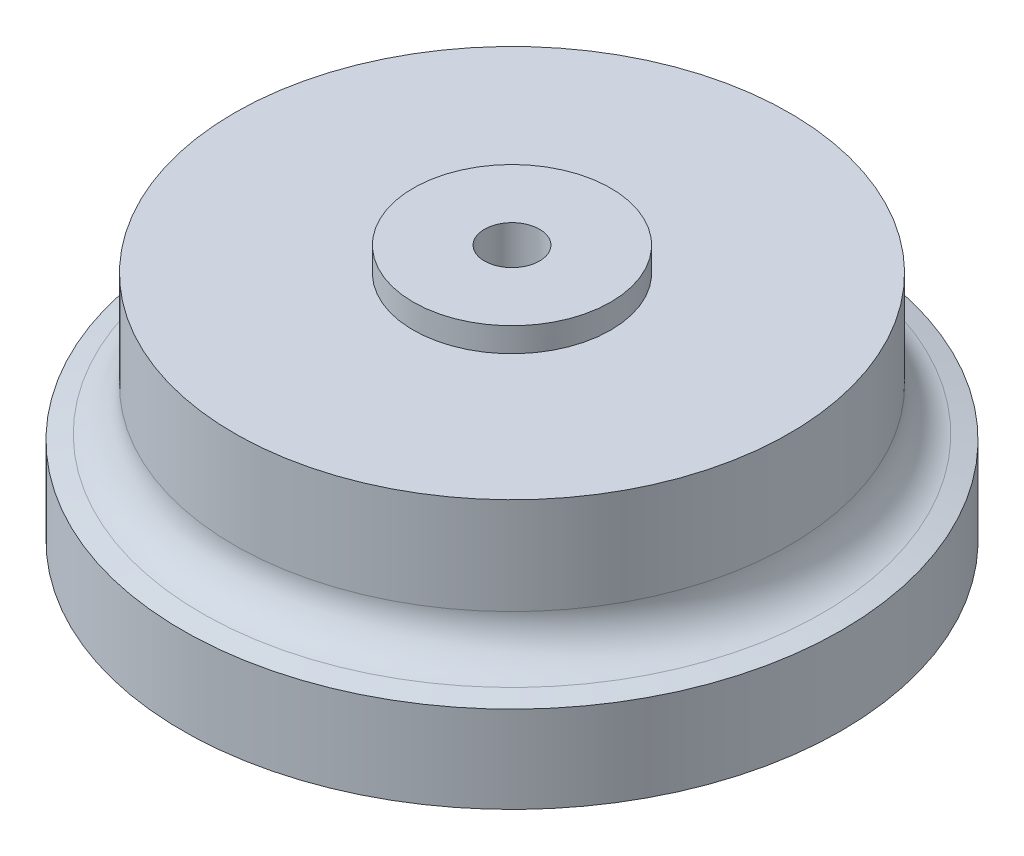
ISO-10303-21;
HEADER;
FILE_DESCRIPTION(('STEP AP214'),'2;1');
FILE_NAME('part.step','',(''),(''),'','','');
FILE_SCHEMA(('AUTOMOTIVE_DESIGN { 1 0 10303 214 1 1 1 1 }'));
ENDSEC;
DATA;
#1=APPLICATION_CONTEXT('core data for automotive mechanical design processes');
#2=APPLICATION_PROTOCOL_DEFINITION('international standard','automotive_design',2000,#1);
#3=PRODUCT_CONTEXT('',#1,'mechanical');
#4=PRODUCT('Part','Part','',(#3));
#5=PRODUCT_RELATED_PRODUCT_CATEGORY('part','',(#4));
#6=PRODUCT_DEFINITION_FORMATION('','',#4);
#7=PRODUCT_DEFINITION_CONTEXT('part definition',#1,'design');
#8=PRODUCT_DEFINITION('design','',#6,#7);
#9=PRODUCT_DEFINITION_SHAPE('','',#8);
#10=(LENGTH_UNIT() NAMED_UNIT(*) SI_UNIT(.MILLI.,.METRE.));
#11=(NAMED_UNIT(*) PLANE_ANGLE_UNIT() SI_UNIT($,.RADIAN.));
#12=(NAMED_UNIT(*) SI_UNIT($,.STERADIAN.) SOLID_ANGLE_UNIT());
#13=UNCERTAINTY_MEASURE_WITH_UNIT(LENGTH_MEASURE(1.E-05),#10,'distance_accuracy_value','');
#14=(GEOMETRIC_REPRESENTATION_CONTEXT(3) GLOBAL_UNCERTAINTY_ASSIGNED_CONTEXT((#13)) GLOBAL_UNIT_ASSIGNED_CONTEXT((#10,
#11,#12)) REPRESENTATION_CONTEXT('',''));
#15=CARTESIAN_POINT('',(0.,0.,0.));
#16=DIRECTION('',(0.,0.,1.));
#17=DIRECTION('',(1.,0.,0.));
#18=AXIS2_PLACEMENT_3D('',#15,#16,#17);
#19=CARTESIAN_POINT('',(31.98495,26.67,0.));
#20=DIRECTION('',(0.,-1.,0.));
#21=DIRECTION('',(1.,0.,0.));
#22=AXIS2_PLACEMENT_3D('',#19,#20,#21);
#23=PLANE('',#22);
#24=CARTESIAN_POINT('',(0.,26.67,0.));
#25=DIRECTION('',(0.,1.,0.));
#26=DIRECTION('',(-1.,0.,0.));
#27=AXIS2_PLACEMENT_3D('',#24,#25,#26);
#28=CIRCLE('',#27,31.98495);
#29=CARTESIAN_POINT('',(-31.98495,26.67,0.));
#30=VERTEX_POINT('',#29);
#31=EDGE_CURVE('E69',#30,#30,#28,.T.);
#32=ORIENTED_EDGE('',*,*,#31,.T.);
#33=EDGE_LOOP('',(#32));
#34=FACE_BOUND('',#33,.T.);
#35=CARTESIAN_POINT('',(0.,26.67,0.));
#36=DIRECTION('',(0.,-1.,0.));
#37=DIRECTION('',(1.,0.,0.));
#38=AXIS2_PLACEMENT_3D('',#35,#36,#37);
#39=CIRCLE('',#38,11.3792);
#40=CARTESIAN_POINT('',(11.3792,26.67,0.));
#41=VERTEX_POINT('',#40);
#42=EDGE_CURVE('E10',#41,#41,#39,.F.);
#43=ORIENTED_EDGE('',*,*,#42,.F.);
#44=EDGE_LOOP('',(#43));
#45=FACE_BOUND('',#44,.T.);
#46=ADVANCED_FACE('F41',(#34,#45),#23,.F.);
#47=CARTESIAN_POINT('',(0.,0.,0.));
#48=DIRECTION('',(0.,1.,0.));
#49=DIRECTION('',(-1.,0.,0.));
#50=AXIS2_PLACEMENT_3D('',#47,#48,#49);
#51=PLANE('',#50);
#52=CARTESIAN_POINT('',(0.,0.,0.));
#53=DIRECTION('',(0.,1.,0.));
#54=DIRECTION('',(0.,0.,1.));
#55=AXIS2_PLACEMENT_3D('',#52,#53,#54);
#56=CIRCLE('',#55,3.17499999999999);
#57=CARTESIAN_POINT('',(0.,0.,3.17499999999999));
#58=VERTEX_POINT('',#57);
#59=EDGE_CURVE('E73',#58,#58,#56,.T.);
#60=ORIENTED_EDGE('',*,*,#59,.T.);
#61=EDGE_LOOP('',(#60));
#62=FACE_BOUND('',#61,.T.);
#63=CARTESIAN_POINT('',(0.,0.,0.));
#64=DIRECTION('',(0.,1.,0.));
#65=DIRECTION('',(-1.,0.,0.));
#66=AXIS2_PLACEMENT_3D('',#63,#64,#65);
#67=CIRCLE('',#66,37.973);
#68=CARTESIAN_POINT('',(-37.973,0.,0.));
#69=VERTEX_POINT('',#68);
#70=EDGE_CURVE('E49',#69,#69,#67,.T.);
#71=ORIENTED_EDGE('',*,*,#70,.F.);
#72=EDGE_LOOP('',(#71));
#73=FACE_BOUND('',#72,.T.);
#74=ADVANCED_FACE('F43',(#62,#73),#51,.F.);
#75=CARTESIAN_POINT('',(0.,26.67,0.));
#76=DIRECTION('',(0.,1.,0.));
#77=DIRECTION('',(-1.,0.,0.));
#78=AXIS2_PLACEMENT_3D('',#75,#76,#77);
#79=CYLINDRICAL_SURFACE('',#78,37.973);
#80=CARTESIAN_POINT('',(0.,10.0076,0.));
#81=DIRECTION('',(0.,1.,0.));
#82=DIRECTION('',(-1.,0.,0.));
#83=AXIS2_PLACEMENT_3D('',#80,#81,#82);
#84=CIRCLE('',#83,37.973);
#85=CARTESIAN_POINT('',(-37.973,10.0076,0.));
#86=VERTEX_POINT('',#85);
#87=EDGE_CURVE('E54',#86,#86,#84,.T.);
#88=ORIENTED_EDGE('',*,*,#87,.F.);
#89=EDGE_LOOP('',(#88));
#90=FACE_BOUND('',#89,.T.);
#91=ORIENTED_EDGE('',*,*,#70,.T.);
#92=EDGE_LOOP('',(#91));
#93=FACE_BOUND('',#92,.T.);
#94=ADVANCED_FACE('F108',(#90,#93),#79,.T.);
#95=CARTESIAN_POINT('',(0.,10.0076,0.));
#96=DIRECTION('',(0.,-1.,0.));
#97=DIRECTION('',(1.,0.,0.));
#98=AXIS2_PLACEMENT_3D('',#95,#96,#97);
#99=CONICAL_SURFACE('',#98,37.973,1.30899693899575);
#100=CARTESIAN_POINT('',(0.,10.6032110631218,0.));
#101=DIRECTION('',(0.,1.,0.));
#102=DIRECTION('',(-1.,0.,0.));
#103=AXIS2_PLACEMENT_3D('',#100,#101,#102);
#104=CIRCLE('',#103,35.7501492508792);
#105=CARTESIAN_POINT('',(-35.7501492508792,10.6032110631218,0.));
#106=VERTEX_POINT('',#105);
#107=EDGE_CURVE('E59',#106,#106,#104,.T.);
#108=ORIENTED_EDGE('',*,*,#107,.F.);
#109=EDGE_LOOP('',(#108));
#110=FACE_BOUND('',#109,.T.);
#111=ORIENTED_EDGE('',*,*,#87,.T.);
#112=EDGE_LOOP('',(#111));
#113=FACE_BOUND('',#112,.T.);
#114=ADVANCED_FACE('F118',(#110,#113),#99,.T.);
#115=CARTESIAN_POINT('',(0.,15.5101142606703,0.));
#116=DIRECTION('',(0.,1.,0.));
#117=DIRECTION('',(-1.,0.,0.));
#118=AXIS2_PLACEMENT_3D('',#115,#116,#117);
#119=TOROIDAL_SURFACE('',#118,37.06495,5.08);
#120=CARTESIAN_POINT('',(0.,15.5101142606703,0.));
#121=DIRECTION('',(0.,1.,0.));
#122=DIRECTION('',(-1.,0.,0.));
#123=AXIS2_PLACEMENT_3D('',#120,#121,#122);
#124=CIRCLE('',#123,31.98495);
#125=CARTESIAN_POINT('',(-31.98495,15.5101142606703,0.));
#126=VERTEX_POINT('',#125);
#127=EDGE_CURVE('E65',#126,#126,#124,.T.);
#128=ORIENTED_EDGE('',*,*,#127,.F.);
#129=EDGE_LOOP('',(#128));
#130=FACE_BOUND('',#129,.T.);
#131=ORIENTED_EDGE('',*,*,#107,.T.);
#132=EDGE_LOOP('',(#131));
#133=FACE_BOUND('',#132,.T.);
#134=ADVANCED_FACE('F114',(#130,#133),#119,.F.);
#135=CARTESIAN_POINT('',(0.,26.67,0.));
#136=DIRECTION('',(0.,1.,0.));
#137=DIRECTION('',(-1.,0.,0.));
#138=AXIS2_PLACEMENT_3D('',#135,#136,#137);
#139=CYLINDRICAL_SURFACE('',#138,31.98495);
#140=ORIENTED_EDGE('',*,*,#31,.F.);
#141=EDGE_LOOP('',(#140));
#142=FACE_BOUND('',#141,.T.);
#143=ORIENTED_EDGE('',*,*,#127,.T.);
#144=EDGE_LOOP('',(#143));
#145=FACE_BOUND('',#144,.T.);
#146=ADVANCED_FACE('F99',(#142,#145),#139,.T.);
#147=CARTESIAN_POINT('',(0.,26.67,0.));
#148=DIRECTION('',(0.,1.,0.));
#149=DIRECTION('',(0.,0.,1.));
#150=AXIS2_PLACEMENT_3D('',#147,#148,#149);
#151=CYLINDRICAL_SURFACE('',#150,3.175);
#152=ORIENTED_EDGE('',*,*,#59,.F.);
#153=EDGE_LOOP('',(#152));
#154=FACE_BOUND('',#153,.T.);
#155=CARTESIAN_POINT('',(0.,29.464,0.));
#156=DIRECTION('',(0.,1.,0.));
#157=DIRECTION('',(0.,0.,1.));
#158=AXIS2_PLACEMENT_3D('',#155,#156,#157);
#159=CIRCLE('',#158,3.175);
#160=CARTESIAN_POINT('',(0.,29.464,3.175));
#161=VERTEX_POINT('',#160);
#162=EDGE_CURVE('E81',#161,#161,#159,.T.);
#163=ORIENTED_EDGE('',*,*,#162,.T.);
#164=EDGE_LOOP('',(#163));
#165=FACE_BOUND('',#164,.T.);
#166=ADVANCED_FACE('F86',(#154,#165),#151,.F.);
#167=CARTESIAN_POINT('',(0.,29.464,0.));
#168=DIRECTION('',(0.,1.,0.));
#169=DIRECTION('',(0.,0.,1.));
#170=AXIS2_PLACEMENT_3D('',#167,#168,#169);
#171=PLANE('',#170);
#172=CARTESIAN_POINT('',(0.,29.464,0.));
#173=DIRECTION('',(0.,1.,0.));
#174=DIRECTION('',(0.,0.,1.));
#175=AXIS2_PLACEMENT_3D('',#172,#173,#174);
#176=CIRCLE('',#175,11.3792);
#177=CARTESIAN_POINT('',(0.,29.464,11.3792));
#178=VERTEX_POINT('',#177);
#179=EDGE_CURVE('E77',#178,#178,#176,.T.);
#180=ORIENTED_EDGE('',*,*,#179,.T.);
#181=EDGE_LOOP('',(#180));
#182=FACE_BOUND('',#181,.T.);
#183=ORIENTED_EDGE('',*,*,#162,.F.);
#184=EDGE_LOOP('',(#183));
#185=FACE_BOUND('',#184,.T.);
#186=ADVANCED_FACE('F88',(#182,#185),#171,.T.);
#187=CARTESIAN_POINT('',(0.,29.464,0.));
#188=DIRECTION('',(0.,-1.,0.));
#189=DIRECTION('',(0.,0.,-1.));
#190=AXIS2_PLACEMENT_3D('',#187,#188,#189);
#191=CYLINDRICAL_SURFACE('',#190,11.3792);
#192=ORIENTED_EDGE('',*,*,#179,.F.);
#193=EDGE_LOOP('',(#192));
#194=FACE_BOUND('',#193,.T.);
#195=ORIENTED_EDGE('',*,*,#42,.T.);
#196=EDGE_LOOP('',(#195));
#197=FACE_BOUND('',#196,.T.);
#198=ADVANCED_FACE('F90',(#194,#197),#191,.T.);
#199=CLOSED_SHELL('',(#46,#74,#94,#114,#134,#146,#166,#186,#198));
#200=MANIFOLD_SOLID_BREP('B2',#199);
#201=ADVANCED_BREP_SHAPE_REPRESENTATION('',(#18,#200),#14);
#202=SHAPE_DEFINITION_REPRESENTATION(#9,#201);
ENDSEC;
END-ISO-10303-21;
